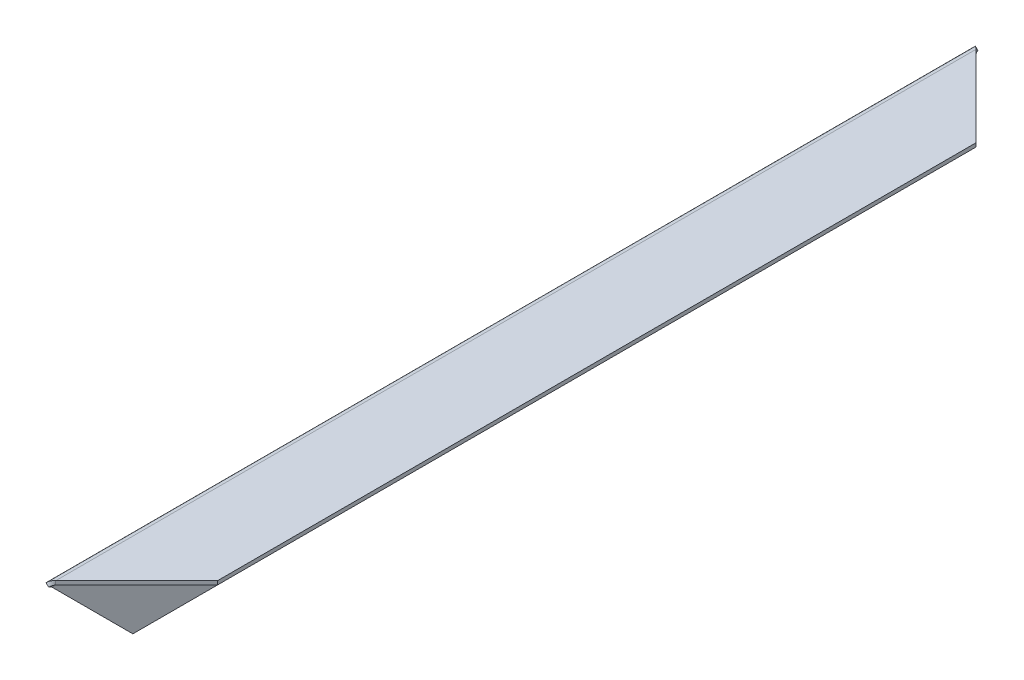
ISO-10303-21;
HEADER;
FILE_DESCRIPTION(('STEP AP214'),'2;1');
FILE_NAME('part.step','',(''),(''),'','','');
FILE_SCHEMA(('AUTOMOTIVE_DESIGN { 1 0 10303 214 1 1 1 1 }'));
ENDSEC;
DATA;
#1=APPLICATION_CONTEXT('core data for automotive mechanical design processes');
#2=APPLICATION_PROTOCOL_DEFINITION('international standard','automotive_design',2000,#1);
#3=PRODUCT_CONTEXT('',#1,'mechanical');
#4=PRODUCT('Part','Part','',(#3));
#5=PRODUCT_RELATED_PRODUCT_CATEGORY('part','',(#4));
#6=PRODUCT_DEFINITION_FORMATION('','',#4);
#7=PRODUCT_DEFINITION_CONTEXT('part definition',#1,'design');
#8=PRODUCT_DEFINITION('design','',#6,#7);
#9=PRODUCT_DEFINITION_SHAPE('','',#8);
#10=(LENGTH_UNIT() NAMED_UNIT(*) SI_UNIT(.MILLI.,.METRE.));
#11=(NAMED_UNIT(*) PLANE_ANGLE_UNIT() SI_UNIT($,.RADIAN.));
#12=(NAMED_UNIT(*) SI_UNIT($,.STERADIAN.) SOLID_ANGLE_UNIT());
#13=UNCERTAINTY_MEASURE_WITH_UNIT(LENGTH_MEASURE(1.E-05),#10,'distance_accuracy_value','');
#14=(GEOMETRIC_REPRESENTATION_CONTEXT(3) GLOBAL_UNCERTAINTY_ASSIGNED_CONTEXT((#13)) GLOBAL_UNIT_ASSIGNED_CONTEXT((#10,
#11,#12)) REPRESENTATION_CONTEXT('',''));
#15=CARTESIAN_POINT('',(0.,0.,0.));
#16=DIRECTION('',(0.,0.,1.));
#17=DIRECTION('',(1.,0.,0.));
#18=AXIS2_PLACEMENT_3D('',#15,#16,#17);
#19=CARTESIAN_POINT('',(-92.6263069999994,0.18833643072165,0.));
#20=DIRECTION('',(-1.,0.,0.));
#21=DIRECTION('',(0.,0.,1.));
#22=AXIS2_PLACEMENT_3D('',#19,#20,#21);
#23=PLANE('',#22);
#24=DIRECTION('',(0.,-0.707106781186615,-0.70710678118648));
#25=VECTOR('',#24,1.);
#26=CARTESIAN_POINT('',(-92.6263070000001,92.0208934307375,91.8325569999984));
#27=LINE('',#26,#25);
#28=CARTESIAN_POINT('',(-92.6263070000001,91.1531069999997,90.9647705692607));
#29=VERTEX_POINT('',#28);
#30=CARTESIAN_POINT('',(-92.626307,75.1616434307375,74.9733070000015));
#31=VERTEX_POINT('',#30);
#32=EDGE_CURVE('E36',#29,#31,#27,.T.);
#33=ORIENTED_EDGE('',*,*,#32,.F.);
#34=DIRECTION('',(0.,0.,-1.));
#35=VECTOR('',#34,1.);
#36=CARTESIAN_POINT('',(-92.6263070000001,91.1531069999997,0.));
#37=LINE('',#36,#35);
#38=CARTESIAN_POINT('',(-92.626307,91.1531069999997,-90.9647705692606));
#39=VERTEX_POINT('',#38);
#40=EDGE_CURVE('E29',#29,#39,#37,.T.);
#41=ORIENTED_EDGE('',*,*,#40,.T.);
#42=DIRECTION('',(0.,0.707106781186615,-0.70710678118648));
#43=VECTOR('',#42,1.);
#44=CARTESIAN_POINT('',(-92.6263070000001,92.0208934307375,-91.8325569999983));
#45=LINE('',#44,#43);
#46=CARTESIAN_POINT('',(-92.626307,75.1616434307375,-74.9733070000015));
#47=VERTEX_POINT('',#46);
#48=EDGE_CURVE('E44',#47,#39,#45,.T.);
#49=ORIENTED_EDGE('',*,*,#48,.F.);
#50=DIRECTION('',(0.,0.,-1.));
#51=VECTOR('',#50,1.);
#52=CARTESIAN_POINT('',(-92.626307,75.1616434307375,74.9733070000015));
#53=LINE('',#52,#51);
#54=EDGE_CURVE('E414',#31,#47,#53,.T.);
#55=ORIENTED_EDGE('',*,*,#54,.F.);
#56=EDGE_LOOP('',(#33,#41,#49,#55));
#57=FACE_BOUND('',#56,.T.);
#58=ADVANCED_FACE('F17',(#57),#23,.T.);
#59=CARTESIAN_POINT('',(-91.8897070000001,92.0208934307375,91.8325569999984));
#60=DIRECTION('',(0.,0.70710678118648,-0.707106781186615));
#61=DIRECTION('',(0.,0.707106781186615,0.70710678118648));
#62=AXIS2_PLACEMENT_3D('',#59,#60,#61);
#63=PLANE('',#62);
#64=CARTESIAN_POINT('',(-92.626307,91.1531069999996,90.9647705692607));
#65=CARTESIAN_POINT('',(-91.889707,91.1531069999997,90.9647705692607));
#66=B_SPLINE_CURVE_WITH_KNOTS('',1,(#64,#65),.UNSPECIFIED.,.F.,.F.,(2,2),(0.,1.),.UNSPECIFIED.);
#67=CARTESIAN_POINT('',(-91.8897070000001,91.1531069999997,90.9647705692607));
#68=VERTEX_POINT('',#67);
#69=EDGE_CURVE('E11',#29,#68,#66,.T.);
#70=ORIENTED_EDGE('',*,*,#69,.F.);
#71=ORIENTED_EDGE('',*,*,#32,.T.);
#72=DIRECTION('',(-1.,0.,0.));
#73=VECTOR('',#72,1.);
#74=CARTESIAN_POINT('',(-91.889707,75.1616434307375,74.9733070000015));
#75=LINE('',#74,#73);
#76=CARTESIAN_POINT('',(-91.889707,75.1616434307375,74.9733070000015));
#77=VERTEX_POINT('',#76);
#78=EDGE_CURVE('E457',#77,#31,#75,.T.);
#79=ORIENTED_EDGE('',*,*,#78,.F.);
#80=DIRECTION('',(0.,-0.707106781186615,-0.70710678118648));
#81=VECTOR('',#80,1.);
#82=CARTESIAN_POINT('',(-91.8897070000001,92.0208934307375,91.8325569999984));
#83=LINE('',#82,#81);
#84=EDGE_CURVE('E260',#68,#77,#83,.T.);
#85=ORIENTED_EDGE('',*,*,#84,.F.);
#86=EDGE_LOOP('',(#70,#71,#79,#85));
#87=FACE_BOUND('',#86,.T.);
#88=ADVANCED_FACE('F19',(#87),#63,.F.);
#89=CARTESIAN_POINT('',(-91.889707,75.1616434307375,74.9733070000015));
#90=DIRECTION('',(0.,1.,0.));
#91=DIRECTION('',(0.,0.,1.));
#92=AXIS2_PLACEMENT_3D('',#89,#90,#91);
#93=PLANE('',#92);
#94=ORIENTED_EDGE('',*,*,#54,.T.);
#95=DIRECTION('',(-1.,0.,0.));
#96=VECTOR('',#95,1.);
#97=CARTESIAN_POINT('',(-91.8897069999999,75.1616434307375,-74.9733070000015));
#98=LINE('',#97,#96);
#99=CARTESIAN_POINT('',(-91.8897069999999,75.1616434307375,-74.9733070000015));
#100=VERTEX_POINT('',#99);
#101=EDGE_CURVE('E455',#100,#47,#98,.T.);
#102=ORIENTED_EDGE('',*,*,#101,.F.);
#103=DIRECTION('',(0.,0.,-1.));
#104=VECTOR('',#103,1.);
#105=CARTESIAN_POINT('',(-91.889707,75.1616434307375,74.9733070000015));
#106=LINE('',#105,#104);
#107=EDGE_CURVE('E453',#77,#100,#106,.T.);
#108=ORIENTED_EDGE('',*,*,#107,.F.);
#109=ORIENTED_EDGE('',*,*,#78,.T.);
#110=EDGE_LOOP('',(#94,#102,#108,#109));
#111=FACE_BOUND('',#110,.T.);
#112=ADVANCED_FACE('F235',(#111),#93,.F.);
#113=CARTESIAN_POINT('',(-91.8897070000001,92.0208934307376,-91.8325569999983));
#114=DIRECTION('',(0.,0.70710678118648,0.707106781186615));
#115=DIRECTION('',(0.,-0.707106781186615,0.70710678118648));
#116=AXIS2_PLACEMENT_3D('',#113,#114,#115);
#117=PLANE('',#116);
#118=CARTESIAN_POINT('',(-91.889707,91.1531069999997,-90.9647705692606));
#119=CARTESIAN_POINT('',(-92.626307,91.1531069999996,-90.9647705692606));
#120=B_SPLINE_CURVE_WITH_KNOTS('',1,(#118,#119),.UNSPECIFIED.,.F.,.F.,(2,2),(0.,1.),.UNSPECIFIED.);
#121=CARTESIAN_POINT('',(-91.889707,91.1531069999997,-90.9647705692606));
#122=VERTEX_POINT('',#121);
#123=EDGE_CURVE('E272',#122,#39,#120,.T.);
#124=ORIENTED_EDGE('',*,*,#123,.F.);
#125=DIRECTION('',(0.,0.707106781186615,-0.70710678118648));
#126=VECTOR('',#125,1.);
#127=CARTESIAN_POINT('',(-91.8897070000001,92.0208934307376,-91.8325569999983));
#128=LINE('',#127,#126);
#129=EDGE_CURVE('E450',#100,#122,#128,.T.);
#130=ORIENTED_EDGE('',*,*,#129,.F.);
#131=ORIENTED_EDGE('',*,*,#101,.T.);
#132=ORIENTED_EDGE('',*,*,#48,.T.);
#133=EDGE_LOOP('',(#124,#130,#131,#132));
#134=FACE_BOUND('',#133,.T.);
#135=ADVANCED_FACE('F238',(#134),#117,.F.);
#136=CARTESIAN_POINT('',(-91.8897069999994,0.18833643072165,0.));
#137=DIRECTION('',(-1.,0.,0.));
#138=DIRECTION('',(0.,0.,1.));
#139=AXIS2_PLACEMENT_3D('',#136,#137,#138);
#140=PLANE('',#139);
#141=DIRECTION('',(0.,0.,-1.));
#142=VECTOR('',#141,1.);
#143=CARTESIAN_POINT('',(-91.8897070000001,91.1531069999997,0.));
#144=LINE('',#143,#142);
#145=EDGE_CURVE('E451',#68,#122,#144,.T.);
#146=ORIENTED_EDGE('',*,*,#145,.F.);
#147=ORIENTED_EDGE('',*,*,#84,.T.);
#148=ORIENTED_EDGE('',*,*,#107,.T.);
#149=ORIENTED_EDGE('',*,*,#129,.T.);
#150=EDGE_LOOP('',(#146,#147,#148,#149));
#151=FACE_BOUND('',#150,.T.);
#152=ADVANCED_FACE('F240',(#151),#140,.F.);
#153=CARTESIAN_POINT('',(-75.1616434307379,91.8897069999997,74.9733070000015));
#154=DIRECTION('',(-1.,0.,0.));
#155=DIRECTION('',(0.,0.,-1.));
#156=AXIS2_PLACEMENT_3D('',#153,#154,#155);
#157=PLANE('',#156);
#158=DIRECTION('',(0.,0.,1.));
#159=VECTOR('',#158,1.);
#160=CARTESIAN_POINT('',(-75.1616434307379,92.6263069999997,74.9733070000015));
#161=LINE('',#160,#159);
#162=CARTESIAN_POINT('',(-75.1616434307379,92.6263069999997,-74.9733070000015));
#163=VERTEX_POINT('',#162);
#164=CARTESIAN_POINT('',(-75.1616434307379,92.6263069999997,74.9733070000015));
#165=VERTEX_POINT('',#164);
#166=EDGE_CURVE('E383',#163,#165,#161,.T.);
#167=ORIENTED_EDGE('',*,*,#166,.T.);
#168=DIRECTION('',(0.,1.,0.));
#169=VECTOR('',#168,1.);
#170=CARTESIAN_POINT('',(-75.1616434307379,91.8897069999997,74.9733070000015));
#171=LINE('',#170,#169);
#172=CARTESIAN_POINT('',(-75.1616434307379,91.8897069999997,74.9733070000015));
#173=VERTEX_POINT('',#172);
#174=EDGE_CURVE('E411',#173,#165,#171,.T.);
#175=ORIENTED_EDGE('',*,*,#174,.F.);
#176=DIRECTION('',(0.,0.,1.));
#177=VECTOR('',#176,1.);
#178=CARTESIAN_POINT('',(-75.1616434307379,91.8897069999997,74.9733070000015));
#179=LINE('',#178,#177);
#180=CARTESIAN_POINT('',(-75.1616434307379,91.8897069999997,-74.9733070000015));
#181=VERTEX_POINT('',#180);
#182=EDGE_CURVE('E202',#181,#173,#179,.T.);
#183=ORIENTED_EDGE('',*,*,#182,.F.);
#184=DIRECTION('',(0.,1.,0.));
#185=VECTOR('',#184,1.);
#186=CARTESIAN_POINT('',(-75.1616434307379,91.8897069999997,-74.9733070000015));
#187=LINE('',#186,#185);
#188=EDGE_CURVE('E200',#181,#163,#187,.T.);
#189=ORIENTED_EDGE('',*,*,#188,.T.);
#190=EDGE_LOOP('',(#167,#175,#183,#189));
#191=FACE_BOUND('',#190,.T.);
#192=ADVANCED_FACE('F242',(#191),#157,.F.);
#193=CARTESIAN_POINT('',(-183.853450430754,91.8897069999994,0.));
#194=DIRECTION('',(0.,1.,0.));
#195=DIRECTION('',(0.,0.,1.));
#196=AXIS2_PLACEMENT_3D('',#193,#194,#195);
#197=PLANE('',#196);
#198=DIRECTION('',(-0.707106781186614,0.,0.707106781186481));
#199=VECTOR('',#198,1.);
#200=CARTESIAN_POINT('',(-92.0208934307379,91.8897069999997,91.8325569999984));
#201=LINE('',#200,#199);
#202=CARTESIAN_POINT('',(-91.153107,91.8897069999997,90.9647705692607));
#203=VERTEX_POINT('',#202);
#204=EDGE_CURVE('E191',#173,#203,#201,.T.);
#205=ORIENTED_EDGE('',*,*,#204,.T.);
#206=DIRECTION('',(0.,0.,-1.));
#207=VECTOR('',#206,1.);
#208=CARTESIAN_POINT('',(-91.153107,91.8897069999997,0.));
#209=LINE('',#208,#207);
#210=CARTESIAN_POINT('',(-91.153107,91.8897069999997,-90.9647705692606));
#211=VERTEX_POINT('',#210);
#212=EDGE_CURVE('E133',#203,#211,#209,.T.);
#213=ORIENTED_EDGE('',*,*,#212,.T.);
#214=DIRECTION('',(0.707106781186614,0.,0.707106781186481));
#215=VECTOR('',#214,1.);
#216=CARTESIAN_POINT('',(-92.0208934307379,91.8897069999997,-91.8325569999983));
#217=LINE('',#216,#215);
#218=EDGE_CURVE('E188',#211,#181,#217,.T.);
#219=ORIENTED_EDGE('',*,*,#218,.T.);
#220=ORIENTED_EDGE('',*,*,#182,.T.);
#221=EDGE_LOOP('',(#205,#213,#219,#220));
#222=FACE_BOUND('',#221,.T.);
#223=ADVANCED_FACE('F187',(#222),#197,.F.);
#224=CARTESIAN_POINT('',(-92.0208934307379,91.8897069999997,-91.8325569999983));
#225=DIRECTION('',(-0.707106781186481,0.,0.707106781186614));
#226=DIRECTION('',(-0.707106781186614,0.,-0.707106781186481));
#227=AXIS2_PLACEMENT_3D('',#224,#225,#226);
#228=PLANE('',#227);
#229=ORIENTED_EDGE('',*,*,#218,.F.);
#230=CARTESIAN_POINT('',(-91.153107,92.6263069999997,-90.9647705692606));
#231=CARTESIAN_POINT('',(-91.153107,91.8897069999997,-90.9647705692606));
#232=B_SPLINE_CURVE_WITH_KNOTS('',1,(#230,#231),.UNSPECIFIED.,.F.,.F.,(2,2),(0.,1.),.UNSPECIFIED.);
#233=CARTESIAN_POINT('',(-91.153107,92.6263069999997,-90.9647705692606));
#234=VERTEX_POINT('',#233);
#235=EDGE_CURVE('E197',#211,#234,#232,.F.);
#236=ORIENTED_EDGE('',*,*,#235,.T.);
#237=DIRECTION('',(0.707106781186614,0.,0.707106781186481));
#238=VECTOR('',#237,1.);
#239=CARTESIAN_POINT('',(-92.0208934307379,92.6263069999997,-91.8325569999983));
#240=LINE('',#239,#238);
#241=EDGE_CURVE('E386',#234,#163,#240,.T.);
#242=ORIENTED_EDGE('',*,*,#241,.T.);
#243=ORIENTED_EDGE('',*,*,#188,.F.);
#244=EDGE_LOOP('',(#229,#236,#242,#243));
#245=FACE_BOUND('',#244,.T.);
#246=ADVANCED_FACE('F196',(#245),#228,.F.);
#247=CARTESIAN_POINT('',(-183.853450430754,92.6263069999994,0.));
#248=DIRECTION('',(0.,1.,0.));
#249=DIRECTION('',(0.,0.,1.));
#250=AXIS2_PLACEMENT_3D('',#247,#248,#249);
#251=PLANE('',#250);
#252=DIRECTION('',(0.,0.,-1.));
#253=VECTOR('',#252,1.);
#254=CARTESIAN_POINT('',(-91.153107,92.6263069999997,0.));
#255=LINE('',#254,#253);
#256=CARTESIAN_POINT('',(-91.153107,92.6263069999997,90.9647705692607));
#257=VERTEX_POINT('',#256);
#258=EDGE_CURVE('E114',#257,#234,#255,.T.);
#259=ORIENTED_EDGE('',*,*,#258,.F.);
#260=DIRECTION('',(-0.707106781186614,0.,0.707106781186481));
#261=VECTOR('',#260,1.);
#262=CARTESIAN_POINT('',(-92.0208934307379,92.6263069999997,91.8325569999984));
#263=LINE('',#262,#261);
#264=EDGE_CURVE('E221',#165,#257,#263,.T.);
#265=ORIENTED_EDGE('',*,*,#264,.F.);
#266=ORIENTED_EDGE('',*,*,#166,.F.);
#267=ORIENTED_EDGE('',*,*,#241,.F.);
#268=EDGE_LOOP('',(#259,#265,#266,#267));
#269=FACE_BOUND('',#268,.T.);
#270=ADVANCED_FACE('F233',(#269),#251,.T.);
#271=CARTESIAN_POINT('',(-92.0208934307379,91.8897069999997,91.8325569999984));
#272=DIRECTION('',(-0.707106781186481,0.,-0.707106781186614));
#273=DIRECTION('',(0.707106781186614,0.,-0.707106781186481));
#274=AXIS2_PLACEMENT_3D('',#271,#272,#273);
#275=PLANE('',#274);
#276=ORIENTED_EDGE('',*,*,#264,.T.);
#277=CARTESIAN_POINT('',(-91.153107,91.8897069999997,90.9647705692607));
#278=CARTESIAN_POINT('',(-91.153107,92.6263069999997,90.9647705692607));
#279=B_SPLINE_CURVE_WITH_KNOTS('',1,(#277,#278),.UNSPECIFIED.,.F.,.F.,(2,2),(0.,1.),.UNSPECIFIED.);
#280=EDGE_CURVE('E216',#257,#203,#279,.F.);
#281=ORIENTED_EDGE('',*,*,#280,.T.);
#282=ORIENTED_EDGE('',*,*,#204,.F.);
#283=ORIENTED_EDGE('',*,*,#174,.T.);
#284=EDGE_LOOP('',(#276,#281,#282,#283));
#285=FACE_BOUND('',#284,.T.);
#286=ADVANCED_FACE('F223',(#285),#275,.F.);
#287=CARTESIAN_POINT('',(-92.1948167100441,92.1948167100437,91.8325569999984));
#288=CARTESIAN_POINT('',(-92.3311919267768,92.0584414933109,91.6879092391921));
#289=CARTESIAN_POINT('',(-92.4403691073235,91.895038481882,91.5432948564191));
#290=CARTESIAN_POINT('',(-92.5879635472678,91.5387139832377,91.2540327128399));
#291=CARTESIAN_POINT('',(-92.626307,91.3459706810746,91.1094183300669));
#292=CARTESIAN_POINT('',(-92.626307,91.1531069999996,90.9647705692607));
#293=CARTESIAN_POINT('',(-91.6739618550221,91.6739618550217,91.8325569999984));
#294=CARTESIAN_POINT('',(-91.7421453784557,91.6057783315881,91.6879179046431));
#295=CARTESIAN_POINT('',(-91.7967380536618,91.5240727409409,91.5432948564191));
#296=CARTESIAN_POINT('',(-91.8705352736339,91.3459104916187,91.2540327128399));
#297=CARTESIAN_POINT('',(-91.889707,91.2495330635698,91.109409664616));
#298=CARTESIAN_POINT('',(-91.889707,91.1531069999997,90.9647705692607));
#299=B_SPLINE_SURFACE_WITH_KNOTS('',1,3,((#287,#288,#289,#290,#291,#292),(#293,#294,#295,#296,
#297,#298)),.UNSPECIFIED.,.F.,.F.,.F.,(2,2),(4,2,4),(0.,1.),(0.,0.5,1.),.UNSPECIFIED.);
#300=CARTESIAN_POINT('',(-92.1948167100441,92.1948167100437,91.8325569999983));
#301=CARTESIAN_POINT('',(-91.6739618550221,91.6739618550217,91.8325569999983));
#302=B_SPLINE_CURVE_WITH_KNOTS('',1,(#300,#301),.UNSPECIFIED.,.F.,.F.,(2,2),(0.,1.),.UNSPECIFIED.);
#303=CARTESIAN_POINT('',(-92.1948169457465,92.1948164743412,91.8325567499982));
#304=VERTEX_POINT('',#303);
#305=CARTESIAN_POINT('',(-91.6739618550221,91.6739618550217,91.8325569999984));
#306=VERTEX_POINT('',#305);
#307=EDGE_CURVE('E99',#304,#306,#302,.T.);
#308=CARTESIAN_POINT('',(-92.1948167100441,92.1948167100437,91.8325569999984));
#309=CARTESIAN_POINT('',(-92.3311919267768,92.0584414933109,91.6879092391921));
#310=CARTESIAN_POINT('',(-92.4403691073235,91.895038481882,91.5432948564191));
#311=CARTESIAN_POINT('',(-92.5879635472678,91.5387139832377,91.2540327128399));
#312=CARTESIAN_POINT('',(-92.626307,91.3459706810746,91.1094183300669));
#313=CARTESIAN_POINT('',(-92.626307,91.1531069999996,90.9647705692607));
#314=B_SPLINE_CURVE_WITH_KNOTS('',3,(#308,#309,#310,#311,#312,#313),.UNSPECIFIED.,.F.,.F.,(4,2,
4),(0.,0.5,1.),.UNSPECIFIED.);
#315=EDGE_CURVE('E266',#304,#29,#314,.T.);
#316=CARTESIAN_POINT('',(-91.889707,91.1531069999997,90.9647705692607));
#317=CARTESIAN_POINT('',(-91.889707,91.2495330635698,91.109409664616));
#318=CARTESIAN_POINT('',(-91.8705352736339,91.3459104916187,91.2540327128399));
#319=CARTESIAN_POINT('',(-91.7967380536618,91.5240727409409,91.5432948564191));
#320=CARTESIAN_POINT('',(-91.7421453784557,91.6057783315881,91.6879179046431));
#321=CARTESIAN_POINT('',(-91.6739618550221,91.6739618550217,91.8325569999984));
#322=B_SPLINE_CURVE_WITH_KNOTS('',3,(#316,#317,#318,#319,#320,#321),.UNSPECIFIED.,.F.,.F.,(4,2,
4),(0.,0.5,1.),.UNSPECIFIED.);
#323=EDGE_CURVE('E119',#306,#68,#322,.F.);
#324=ORIENTED_EDGE('',*,*,#307,.F.);
#325=ORIENTED_EDGE('',*,*,#315,.T.);
#326=ORIENTED_EDGE('',*,*,#69,.T.);
#327=ORIENTED_EDGE('',*,*,#323,.F.);
#328=EDGE_LOOP('',(#324,#325,#326,#327));
#329=FACE_BOUND('',#328,.T.);
#330=ADVANCED_FACE('F121',(#329),#299,.F.);
#331=CARTESIAN_POINT('',(-92.626307,91.1531069999996,-90.9647705692606));
#332=CARTESIAN_POINT('',(-92.626307,91.3459706810746,-91.1094183300668));
#333=CARTESIAN_POINT('',(-92.5879635472678,91.5387139832378,-91.2540327128399));
#334=CARTESIAN_POINT('',(-92.4403691073235,91.8950384818821,-91.5432948564191));
#335=CARTESIAN_POINT('',(-92.3311919267768,92.058441493311,-91.6879092391921));
#336=CARTESIAN_POINT('',(-92.1948167100441,92.1948167100437,-91.8325569999983));
#337=CARTESIAN_POINT('',(-91.889707,91.1531069999997,-90.9647705692606));
#338=CARTESIAN_POINT('',(-91.889707,91.2495330635699,-91.109409664616));
#339=CARTESIAN_POINT('',(-91.8705352736339,91.3459104916187,-91.2540327128399));
#340=CARTESIAN_POINT('',(-91.7967380536618,91.5240727409409,-91.5432948564191));
#341=CARTESIAN_POINT('',(-91.7421453784557,91.605778331588,-91.687917904643));
#342=CARTESIAN_POINT('',(-91.673961855022,91.6739618550217,-91.8325569999983));
#343=B_SPLINE_SURFACE_WITH_KNOTS('',1,3,((#331,#332,#333,#334,#335,#336),(#337,#338,#339,#340,
#341,#342)),.UNSPECIFIED.,.F.,.F.,.F.,(2,2),(4,2,4),(0.,1.),(0.,0.5,1.),.UNSPECIFIED.);
#344=CARTESIAN_POINT('',(-92.626307,91.1531069999996,-90.9647705692606));
#345=CARTESIAN_POINT('',(-92.626307,91.3459706810746,-91.1094183300668));
#346=CARTESIAN_POINT('',(-92.5879635472678,91.5387139832378,-91.2540327128399));
#347=CARTESIAN_POINT('',(-92.4403691073235,91.8950384818821,-91.5432948564191));
#348=CARTESIAN_POINT('',(-92.3311919267768,92.058441493311,-91.6879092391921));
#349=CARTESIAN_POINT('',(-92.1948167100441,92.1948167100437,-91.8325569999983));
#350=B_SPLINE_CURVE_WITH_KNOTS('',3,(#344,#345,#346,#347,#348,#349),.UNSPECIFIED.,.F.,.F.,(4,2,
4),(0.,0.5,1.),.UNSPECIFIED.);
#351=CARTESIAN_POINT('',(-92.1948169457464,92.1948164743413,-91.8325567499982));
#352=VERTEX_POINT('',#351);
#353=EDGE_CURVE('E269',#39,#352,#350,.T.);
#354=CARTESIAN_POINT('',(-92.1948167100441,92.1948167100437,-91.8325569999983));
#355=CARTESIAN_POINT('',(-91.673961855022,91.6739618550217,-91.8325569999983));
#356=B_SPLINE_CURVE_WITH_KNOTS('',1,(#354,#355),.UNSPECIFIED.,.F.,.F.,(2,2),(0.,1.),.UNSPECIFIED.);
#357=CARTESIAN_POINT('',(-91.673961855022,91.6739618550217,-91.8325569999983));
#358=VERTEX_POINT('',#357);
#359=EDGE_CURVE('E115',#352,#358,#356,.T.);
#360=CARTESIAN_POINT('',(-91.673961855022,91.6739618550217,-91.8325569999983));
#361=CARTESIAN_POINT('',(-91.7421453784557,91.605778331588,-91.687917904643));
#362=CARTESIAN_POINT('',(-91.7967380536618,91.5240727409409,-91.5432948564191));
#363=CARTESIAN_POINT('',(-91.8705352736339,91.3459104916187,-91.2540327128399));
#364=CARTESIAN_POINT('',(-91.889707,91.2495330635699,-91.109409664616));
#365=CARTESIAN_POINT('',(-91.889707,91.1531069999997,-90.9647705692606));
#366=B_SPLINE_CURVE_WITH_KNOTS('',3,(#360,#361,#362,#363,#364,#365),.UNSPECIFIED.,.F.,.F.,(4,2,
4),(0.,0.5,1.),.UNSPECIFIED.);
#367=EDGE_CURVE('E126',#122,#358,#366,.F.);
#368=ORIENTED_EDGE('',*,*,#123,.T.);
#369=ORIENTED_EDGE('',*,*,#353,.T.);
#370=ORIENTED_EDGE('',*,*,#359,.T.);
#371=ORIENTED_EDGE('',*,*,#367,.F.);
#372=EDGE_LOOP('',(#368,#369,#370,#371));
#373=FACE_BOUND('',#372,.T.);
#374=ADVANCED_FACE('F287',(#373),#343,.F.);
#375=CARTESIAN_POINT('',(-92.1948167100441,92.1948167100437,-91.8325569999983));
#376=CARTESIAN_POINT('',(-92.0584414933113,92.3311919267765,-91.6879092391921));
#377=CARTESIAN_POINT('',(-91.8950384818824,92.4403691073232,-91.5432948564191));
#378=CARTESIAN_POINT('',(-91.5387139832381,92.5879635472675,-91.2540327128399));
#379=CARTESIAN_POINT('',(-91.345970681075,92.6263069999997,-91.1094183300668));
#380=CARTESIAN_POINT('',(-91.153107,92.6263069999997,-90.9647705692606));
#381=CARTESIAN_POINT('',(-91.673961855022,91.6739618550217,-91.8325569999983));
#382=CARTESIAN_POINT('',(-91.6057783315884,91.7421453784553,-91.687917904643));
#383=CARTESIAN_POINT('',(-91.5240727409412,91.7967380536614,-91.5432948564191));
#384=CARTESIAN_POINT('',(-91.3459104916191,91.8705352736336,-91.2540327128399));
#385=CARTESIAN_POINT('',(-91.2495330635702,91.8897069999997,-91.1094096646159));
#386=CARTESIAN_POINT('',(-91.153107,91.8897069999997,-90.9647705692606));
#387=B_SPLINE_SURFACE_WITH_KNOTS('',1,3,((#375,#376,#377,#378,#379,#380),(#381,#382,#383,#384,
#385,#386)),.UNSPECIFIED.,.F.,.F.,.F.,(2,2),(4,2,4),(0.,1.),(0.,0.5,1.),.UNSPECIFIED.);
#388=CARTESIAN_POINT('',(-92.1948167100441,92.1948167100437,-91.8325569999983));
#389=CARTESIAN_POINT('',(-92.0584414933113,92.3311919267765,-91.6879092391921));
#390=CARTESIAN_POINT('',(-91.8950384818824,92.4403691073232,-91.5432948564191));
#391=CARTESIAN_POINT('',(-91.5387139832381,92.5879635472675,-91.2540327128399));
#392=CARTESIAN_POINT('',(-91.345970681075,92.6263069999997,-91.1094183300668));
#393=CARTESIAN_POINT('',(-91.153107,92.6263069999997,-90.9647705692606));
#394=B_SPLINE_CURVE_WITH_KNOTS('',3,(#388,#389,#390,#391,#392,#393),.UNSPECIFIED.,.F.,.F.,(4,2,
4),(0.,0.5,1.),.UNSPECIFIED.);
#395=EDGE_CURVE('E370',#352,#234,#394,.T.);
#396=CARTESIAN_POINT('',(-91.153107,91.8897069999997,-90.9647705692606));
#397=CARTESIAN_POINT('',(-91.2495330635702,91.8897069999997,-91.1094096646159));
#398=CARTESIAN_POINT('',(-91.3459104916191,91.8705352736336,-91.2540327128399));
#399=CARTESIAN_POINT('',(-91.5240727409412,91.7967380536614,-91.5432948564191));
#400=CARTESIAN_POINT('',(-91.6057783315884,91.7421453784553,-91.687917904643));
#401=CARTESIAN_POINT('',(-91.673961855022,91.6739618550217,-91.8325569999983));
#402=B_SPLINE_CURVE_WITH_KNOTS('',3,(#396,#397,#398,#399,#400,#401),.UNSPECIFIED.,.F.,.F.,(4,2,
4),(0.,0.5,1.),.UNSPECIFIED.);
#403=EDGE_CURVE('E134',#358,#211,#402,.F.);
#404=ORIENTED_EDGE('',*,*,#359,.F.);
#405=ORIENTED_EDGE('',*,*,#395,.T.);
#406=ORIENTED_EDGE('',*,*,#235,.F.);
#407=ORIENTED_EDGE('',*,*,#403,.F.);
#408=EDGE_LOOP('',(#404,#405,#406,#407));
#409=FACE_BOUND('',#408,.T.);
#410=ADVANCED_FACE('F157',(#409),#387,.F.);
#411=CARTESIAN_POINT('',(-91.153107,92.6263069999997,90.9647705692607));
#412=CARTESIAN_POINT('',(-91.345970681075,92.6263069999997,91.1094183300669));
#413=CARTESIAN_POINT('',(-91.5387139832381,92.5879635472674,91.2540327128399));
#414=CARTESIAN_POINT('',(-91.8950384818825,92.4403691073231,91.5432948564191));
#415=CARTESIAN_POINT('',(-92.0584414933113,92.3311919267764,91.6879092391921));
#416=CARTESIAN_POINT('',(-92.1948167100441,92.1948167100437,91.8325569999983));
#417=CARTESIAN_POINT('',(-91.153107,91.8897069999997,90.9647705692607));
#418=CARTESIAN_POINT('',(-91.2495330635703,91.8897069999997,91.109409664616));
#419=CARTESIAN_POINT('',(-91.3459104916191,91.8705352736335,91.2540327128399));
#420=CARTESIAN_POINT('',(-91.5240727409413,91.7967380536614,91.5432948564191));
#421=CARTESIAN_POINT('',(-91.6057783315885,91.7421453784553,91.6879179046431));
#422=CARTESIAN_POINT('',(-91.6739618550221,91.6739618550217,91.8325569999983));
#423=B_SPLINE_SURFACE_WITH_KNOTS('',1,3,((#411,#412,#413,#414,#415,#416),(#417,#418,#419,#420,
#421,#422)),.UNSPECIFIED.,.F.,.F.,.F.,(2,2),(4,2,4),(0.,1.),(0.,0.5,1.),.UNSPECIFIED.);
#424=CARTESIAN_POINT('',(-91.153107,92.6263069999997,90.9647705692607));
#425=CARTESIAN_POINT('',(-91.345970681075,92.6263069999997,91.1094183300669));
#426=CARTESIAN_POINT('',(-91.5387139832381,92.5879635472674,91.2540327128399));
#427=CARTESIAN_POINT('',(-91.8950384818825,92.4403691073231,91.5432948564191));
#428=CARTESIAN_POINT('',(-92.0584414933113,92.3311919267764,91.6879092391921));
#429=CARTESIAN_POINT('',(-92.1948167100441,92.1948167100437,91.8325569999983));
#430=B_SPLINE_CURVE_WITH_KNOTS('',3,(#424,#425,#426,#427,#428,#429),.UNSPECIFIED.,.F.,.F.,(4,2,
4),(0.,0.5,1.),.UNSPECIFIED.);
#431=EDGE_CURVE('E108',#257,#304,#430,.T.);
#432=CARTESIAN_POINT('',(-91.6739618550221,91.6739618550217,91.8325569999983));
#433=CARTESIAN_POINT('',(-91.6057783315885,91.7421453784553,91.6879179046431));
#434=CARTESIAN_POINT('',(-91.5240727409413,91.7967380536614,91.5432948564191));
#435=CARTESIAN_POINT('',(-91.3459104916191,91.8705352736335,91.2540327128399));
#436=CARTESIAN_POINT('',(-91.2495330635703,91.8897069999997,91.109409664616));
#437=CARTESIAN_POINT('',(-91.153107,91.8897069999997,90.9647705692607));
#438=B_SPLINE_CURVE_WITH_KNOTS('',3,(#432,#433,#434,#435,#436,#437),.UNSPECIFIED.,.F.,.F.,(4,2,
4),(0.,0.5,1.),.UNSPECIFIED.);
#439=EDGE_CURVE('E104',#203,#306,#438,.F.);
#440=ORIENTED_EDGE('',*,*,#431,.T.);
#441=ORIENTED_EDGE('',*,*,#307,.T.);
#442=ORIENTED_EDGE('',*,*,#439,.F.);
#443=ORIENTED_EDGE('',*,*,#280,.F.);
#444=EDGE_LOOP('',(#440,#441,#442,#443));
#445=FACE_BOUND('',#444,.T.);
#446=ADVANCED_FACE('F102',(#445),#423,.F.);
#447=CARTESIAN_POINT('',(-91.153107,91.1531069999996,183.674791121017));
#448=DIRECTION('',(0.,0.,-1.));
#449=DIRECTION('',(1.,0.,0.));
#450=AXIS2_PLACEMENT_3D('',#447,#448,#449);
#451=CYLINDRICAL_SURFACE('',#450,0.7366);
#452=ORIENTED_EDGE('',*,*,#212,.F.);
#453=ORIENTED_EDGE('',*,*,#439,.T.);
#454=ORIENTED_EDGE('',*,*,#323,.T.);
#455=ORIENTED_EDGE('',*,*,#145,.T.);
#456=ORIENTED_EDGE('',*,*,#367,.T.);
#457=ORIENTED_EDGE('',*,*,#403,.T.);
#458=EDGE_LOOP('',(#452,#453,#454,#455,#456,#457));
#459=FACE_BOUND('',#458,.T.);
#460=ADVANCED_FACE('F130',(#459),#451,.F.);
#461=CARTESIAN_POINT('',(-91.153107,91.1531069999996,183.674791121017));
#462=DIRECTION('',(0.,0.,-1.));
#463=DIRECTION('',(1.,0.,0.));
#464=AXIS2_PLACEMENT_3D('',#461,#462,#463);
#465=CYLINDRICAL_SURFACE('',#464,1.4732);
#466=ORIENTED_EDGE('',*,*,#258,.T.);
#467=ORIENTED_EDGE('',*,*,#395,.F.);
#468=ORIENTED_EDGE('',*,*,#353,.F.);
#469=ORIENTED_EDGE('',*,*,#40,.F.);
#470=ORIENTED_EDGE('',*,*,#315,.F.);
#471=ORIENTED_EDGE('',*,*,#431,.F.);
#472=EDGE_LOOP('',(#466,#467,#468,#469,#470,#471));
#473=FACE_BOUND('',#472,.T.);
#474=ADVANCED_FACE('F156',(#473),#465,.T.);
#475=CLOSED_SHELL('',(#58,#88,#112,#135,#152,#192,#223,#246,#270,#286,#330,#374,#410,#446,#460,#474));
#476=MANIFOLD_SOLID_BREP('B1',#475);
#477=ADVANCED_BREP_SHAPE_REPRESENTATION('',(#18,#476),#14);
#478=SHAPE_DEFINITION_REPRESENTATION(#9,#477);
ENDSEC;
END-ISO-10303-21;
